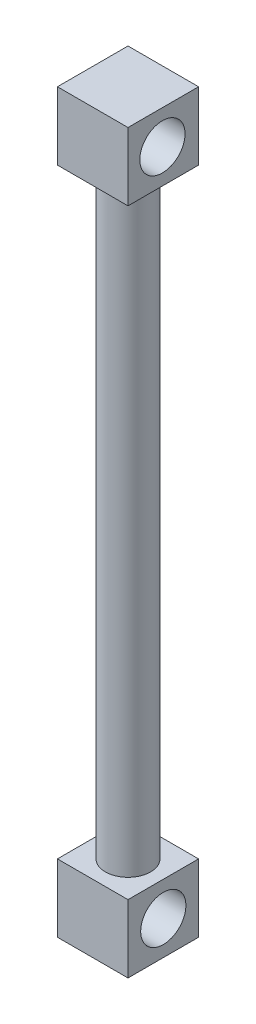
ISO-10303-21;
HEADER;
FILE_DESCRIPTION(('STEP AP214'),'2;1');
FILE_NAME('part.step','',(''),(''),'','','');
FILE_SCHEMA(('AUTOMOTIVE_DESIGN { 1 0 10303 214 1 1 1 1 }'));
ENDSEC;
DATA;
#1=APPLICATION_CONTEXT('core data for automotive mechanical design processes');
#2=APPLICATION_PROTOCOL_DEFINITION('international standard','automotive_design',2000,#1);
#3=PRODUCT_CONTEXT('',#1,'mechanical');
#4=PRODUCT('Part','Part','',(#3));
#5=PRODUCT_RELATED_PRODUCT_CATEGORY('part','',(#4));
#6=PRODUCT_DEFINITION_FORMATION('','',#4);
#7=PRODUCT_DEFINITION_CONTEXT('part definition',#1,'design');
#8=PRODUCT_DEFINITION('design','',#6,#7);
#9=PRODUCT_DEFINITION_SHAPE('','',#8);
#10=(LENGTH_UNIT() NAMED_UNIT(*) SI_UNIT(.MILLI.,.METRE.));
#11=(NAMED_UNIT(*) PLANE_ANGLE_UNIT() SI_UNIT($,.RADIAN.));
#12=(NAMED_UNIT(*) SI_UNIT($,.STERADIAN.) SOLID_ANGLE_UNIT());
#13=UNCERTAINTY_MEASURE_WITH_UNIT(LENGTH_MEASURE(1.E-05),#10,'distance_accuracy_value','');
#14=(GEOMETRIC_REPRESENTATION_CONTEXT(3) GLOBAL_UNCERTAINTY_ASSIGNED_CONTEXT((#13)) GLOBAL_UNIT_ASSIGNED_CONTEXT((#10,
#11,#12)) REPRESENTATION_CONTEXT('',''));
#15=CARTESIAN_POINT('',(0.,0.,0.));
#16=DIRECTION('',(0.,0.,1.));
#17=DIRECTION('',(1.,0.,0.));
#18=AXIS2_PLACEMENT_3D('',#15,#16,#17);
#19=CARTESIAN_POINT('',(0.,-13.28,1.56));
#20=DIRECTION('',(0.,1.,0.));
#21=DIRECTION('',(0.,0.,1.));
#22=AXIS2_PLACEMENT_3D('',#19,#20,#21);
#23=PLANE('',#22);
#24=CARTESIAN_POINT('',(0.78,-13.28,0.78));
#25=DIRECTION('',(0.,1.,0.));
#26=DIRECTION('',(0.,0.,1.));
#27=AXIS2_PLACEMENT_3D('',#24,#25,#26);
#28=CIRCLE('',#27,0.5);
#29=CARTESIAN_POINT('',(0.78,-13.28,1.28));
#30=VERTEX_POINT('',#29);
#31=EDGE_CURVE('E159',#30,#30,#28,.F.);
#32=ORIENTED_EDGE('',*,*,#31,.T.);
#33=EDGE_LOOP('',(#32));
#34=FACE_BOUND('',#33,.T.);
#35=DIRECTION('',(1.,0.,0.));
#36=VECTOR('',#35,1.);
#37=CARTESIAN_POINT('',(0.,-13.28,0.));
#38=LINE('',#37,#36);
#39=CARTESIAN_POINT('',(0.,-13.28,0.));
#40=VERTEX_POINT('',#39);
#41=CARTESIAN_POINT('',(1.56,-13.28,0.));
#42=VERTEX_POINT('',#41);
#43=EDGE_CURVE('E169',#40,#42,#38,.T.);
#44=ORIENTED_EDGE('',*,*,#43,.F.);
#45=DIRECTION('',(0.,0.,-1.));
#46=VECTOR('',#45,1.);
#47=CARTESIAN_POINT('',(0.,-13.28,1.56));
#48=LINE('',#47,#46);
#49=CARTESIAN_POINT('',(0.,-13.28,1.56));
#50=VERTEX_POINT('',#49);
#51=EDGE_CURVE('E11',#50,#40,#48,.T.);
#52=ORIENTED_EDGE('',*,*,#51,.F.);
#53=DIRECTION('',(1.,0.,0.));
#54=VECTOR('',#53,1.);
#55=CARTESIAN_POINT('',(0.,-13.28,1.56));
#56=LINE('',#55,#54);
#57=CARTESIAN_POINT('',(1.56,-13.28,1.56));
#58=VERTEX_POINT('',#57);
#59=EDGE_CURVE('E160',#50,#58,#56,.T.);
#60=ORIENTED_EDGE('',*,*,#59,.T.);
#61=DIRECTION('',(0.,0.,-1.));
#62=VECTOR('',#61,1.);
#63=CARTESIAN_POINT('',(1.56,-13.28,1.56));
#64=LINE('',#63,#62);
#65=EDGE_CURVE('E80',#58,#42,#64,.T.);
#66=ORIENTED_EDGE('',*,*,#65,.T.);
#67=EDGE_LOOP('',(#44,#52,#60,#66));
#68=FACE_BOUND('',#67,.T.);
#69=ADVANCED_FACE('F39',(#34,#68),#23,.T.);
#70=CARTESIAN_POINT('',(0.,0.,1.56));
#71=DIRECTION('',(-1.,0.,0.));
#72=DIRECTION('',(0.,0.,1.));
#73=AXIS2_PLACEMENT_3D('',#70,#71,#72);
#74=PLANE('',#73);
#75=CARTESIAN_POINT('',(0.,-14.03,0.78));
#76=DIRECTION('',(-1.,0.,0.));
#77=DIRECTION('',(0.,0.,1.));
#78=AXIS2_PLACEMENT_3D('',#75,#76,#77);
#79=CIRCLE('',#78,0.5);
#80=CARTESIAN_POINT('',(0.,-14.03,1.28));
#81=VERTEX_POINT('',#80);
#82=EDGE_CURVE('E189',#81,#81,#79,.T.);
#83=ORIENTED_EDGE('',*,*,#82,.F.);
#84=EDGE_LOOP('',(#83));
#85=FACE_BOUND('',#84,.T.);
#86=DIRECTION('',(0.,1.,0.));
#87=VECTOR('',#86,1.);
#88=CARTESIAN_POINT('',(0.,0.,0.));
#89=LINE('',#88,#87);
#90=CARTESIAN_POINT('',(0.,-14.78,0.));
#91=VERTEX_POINT('',#90);
#92=EDGE_CURVE('E172',#91,#40,#89,.T.);
#93=ORIENTED_EDGE('',*,*,#92,.F.);
#94=DIRECTION('',(0.,0.,-1.));
#95=VECTOR('',#94,1.);
#96=CARTESIAN_POINT('',(0.,-14.78,1.56));
#97=LINE('',#96,#95);
#98=CARTESIAN_POINT('',(0.,-14.78,1.56));
#99=VERTEX_POINT('',#98);
#100=EDGE_CURVE('E48',#99,#91,#97,.T.);
#101=ORIENTED_EDGE('',*,*,#100,.F.);
#102=DIRECTION('',(0.,1.,0.));
#103=VECTOR('',#102,1.);
#104=CARTESIAN_POINT('',(0.,0.,1.56));
#105=LINE('',#104,#103);
#106=EDGE_CURVE('E162',#99,#50,#105,.T.);
#107=ORIENTED_EDGE('',*,*,#106,.T.);
#108=ORIENTED_EDGE('',*,*,#51,.T.);
#109=EDGE_LOOP('',(#93,#101,#107,#108));
#110=FACE_BOUND('',#109,.T.);
#111=ADVANCED_FACE('F198',(#85,#110),#74,.T.);
#112=CARTESIAN_POINT('',(0.,-14.78,1.56));
#113=DIRECTION('',(0.,1.,0.));
#114=DIRECTION('',(0.,0.,1.));
#115=AXIS2_PLACEMENT_3D('',#112,#113,#114);
#116=PLANE('',#115);
#117=DIRECTION('',(1.,0.,0.));
#118=VECTOR('',#117,1.);
#119=CARTESIAN_POINT('',(0.,-14.78,0.));
#120=LINE('',#119,#118);
#121=CARTESIAN_POINT('',(1.56,-14.78,0.));
#122=VERTEX_POINT('',#121);
#123=EDGE_CURVE('E73',#91,#122,#120,.T.);
#124=ORIENTED_EDGE('',*,*,#123,.T.);
#125=DIRECTION('',(0.,0.,-1.));
#126=VECTOR('',#125,1.);
#127=CARTESIAN_POINT('',(1.56,-14.78,1.56));
#128=LINE('',#127,#126);
#129=CARTESIAN_POINT('',(1.56,-14.78,1.56));
#130=VERTEX_POINT('',#129);
#131=EDGE_CURVE('E178',#130,#122,#128,.T.);
#132=ORIENTED_EDGE('',*,*,#131,.F.);
#133=DIRECTION('',(1.,0.,0.));
#134=VECTOR('',#133,1.);
#135=CARTESIAN_POINT('',(0.,-14.78,1.56));
#136=LINE('',#135,#134);
#137=EDGE_CURVE('E166',#99,#130,#136,.T.);
#138=ORIENTED_EDGE('',*,*,#137,.F.);
#139=ORIENTED_EDGE('',*,*,#100,.T.);
#140=EDGE_LOOP('',(#124,#132,#138,#139));
#141=FACE_BOUND('',#140,.T.);
#142=ADVANCED_FACE('F201',(#141),#116,.F.);
#143=CARTESIAN_POINT('',(1.56,0.,1.56));
#144=DIRECTION('',(-1.,0.,0.));
#145=DIRECTION('',(0.,0.,1.));
#146=AXIS2_PLACEMENT_3D('',#143,#144,#145);
#147=PLANE('',#146);
#148=CARTESIAN_POINT('',(1.56,-14.03,0.78));
#149=DIRECTION('',(-1.,0.,0.));
#150=DIRECTION('',(0.,0.,1.));
#151=AXIS2_PLACEMENT_3D('',#148,#149,#150);
#152=CIRCLE('',#151,0.5);
#153=CARTESIAN_POINT('',(1.56,-14.03,1.28));
#154=VERTEX_POINT('',#153);
#155=EDGE_CURVE('E42',#154,#154,#152,.T.);
#156=ORIENTED_EDGE('',*,*,#155,.T.);
#157=EDGE_LOOP('',(#156));
#158=FACE_BOUND('',#157,.T.);
#159=DIRECTION('',(0.,1.,0.));
#160=VECTOR('',#159,1.);
#161=CARTESIAN_POINT('',(1.56,0.,0.));
#162=LINE('',#161,#160);
#163=EDGE_CURVE('E163',#122,#42,#162,.T.);
#164=ORIENTED_EDGE('',*,*,#163,.T.);
#165=ORIENTED_EDGE('',*,*,#65,.F.);
#166=DIRECTION('',(0.,1.,0.));
#167=VECTOR('',#166,1.);
#168=CARTESIAN_POINT('',(1.56,0.,1.56));
#169=LINE('',#168,#167);
#170=EDGE_CURVE('E57',#130,#58,#169,.T.);
#171=ORIENTED_EDGE('',*,*,#170,.F.);
#172=ORIENTED_EDGE('',*,*,#131,.T.);
#173=EDGE_LOOP('',(#164,#165,#171,#172));
#174=FACE_BOUND('',#173,.T.);
#175=ADVANCED_FACE('F208',(#158,#174),#147,.F.);
#176=CARTESIAN_POINT('',(0.,0.,1.56));
#177=DIRECTION('',(0.,0.,1.));
#178=DIRECTION('',(1.,0.,0.));
#179=AXIS2_PLACEMENT_3D('',#176,#177,#178);
#180=PLANE('',#179);
#181=ORIENTED_EDGE('',*,*,#59,.F.);
#182=ORIENTED_EDGE('',*,*,#106,.F.);
#183=ORIENTED_EDGE('',*,*,#137,.T.);
#184=ORIENTED_EDGE('',*,*,#170,.T.);
#185=EDGE_LOOP('',(#181,#182,#183,#184));
#186=FACE_BOUND('',#185,.T.);
#187=ADVANCED_FACE('F210',(#186),#180,.T.);
#188=CARTESIAN_POINT('',(0.,0.,0.));
#189=DIRECTION('',(0.,0.,1.));
#190=DIRECTION('',(1.,0.,0.));
#191=AXIS2_PLACEMENT_3D('',#188,#189,#190);
#192=PLANE('',#191);
#193=ORIENTED_EDGE('',*,*,#43,.T.);
#194=ORIENTED_EDGE('',*,*,#163,.F.);
#195=ORIENTED_EDGE('',*,*,#123,.F.);
#196=ORIENTED_EDGE('',*,*,#92,.T.);
#197=EDGE_LOOP('',(#193,#194,#195,#196));
#198=FACE_BOUND('',#197,.T.);
#199=ADVANCED_FACE('F205',(#198),#192,.F.);
#200=CARTESIAN_POINT('',(0.78,-14.,0.78));
#201=DIRECTION('',(0.,1.,0.));
#202=DIRECTION('',(0.,0.,1.));
#203=AXIS2_PLACEMENT_3D('',#200,#201,#202);
#204=CYLINDRICAL_SURFACE('',#203,0.5);
#205=ORIENTED_EDGE('',*,*,#31,.F.);
#206=EDGE_LOOP('',(#205));
#207=FACE_BOUND('',#206,.T.);
#208=CARTESIAN_POINT('',(0.78,0.,0.78));
#209=DIRECTION('',(0.,-1.,0.));
#210=DIRECTION('',(0.,0.,-1.));
#211=AXIS2_PLACEMENT_3D('',#208,#209,#210);
#212=CIRCLE('',#211,0.5);
#213=CARTESIAN_POINT('',(0.78,0.,0.28));
#214=VERTEX_POINT('',#213);
#215=EDGE_CURVE('E121',#214,#214,#212,.T.);
#216=ORIENTED_EDGE('',*,*,#215,.T.);
#217=EDGE_LOOP('',(#216));
#218=FACE_BOUND('',#217,.T.);
#219=ADVANCED_FACE('F217',(#207,#218),#204,.T.);
#220=CARTESIAN_POINT('',(0.,0.,1.56));
#221=DIRECTION('',(-1.,0.,0.));
#222=DIRECTION('',(0.,0.,1.));
#223=AXIS2_PLACEMENT_3D('',#220,#221,#222);
#224=PLANE('',#223);
#225=CARTESIAN_POINT('',(0.,0.75,0.799406883643374));
#226=DIRECTION('',(-1.,0.,0.));
#227=DIRECTION('',(0.,0.,1.));
#228=AXIS2_PLACEMENT_3D('',#225,#226,#227);
#229=CIRCLE('',#228,0.5);
#230=CARTESIAN_POINT('',(0.,0.75,1.29940688364337));
#231=VERTEX_POINT('',#230);
#232=EDGE_CURVE('E141',#231,#231,#229,.T.);
#233=ORIENTED_EDGE('',*,*,#232,.F.);
#234=EDGE_LOOP('',(#233));
#235=FACE_BOUND('',#234,.T.);
#236=DIRECTION('',(0.,1.,0.));
#237=VECTOR('',#236,1.);
#238=CARTESIAN_POINT('',(0.,0.,0.));
#239=LINE('',#238,#237);
#240=CARTESIAN_POINT('',(0.,0.,0.));
#241=VERTEX_POINT('',#240);
#242=CARTESIAN_POINT('',(0.,1.5,0.));
#243=VERTEX_POINT('',#242);
#244=EDGE_CURVE('E118',#241,#243,#239,.T.);
#245=ORIENTED_EDGE('',*,*,#244,.F.);
#246=DIRECTION('',(0.,0.,-1.));
#247=VECTOR('',#246,1.);
#248=CARTESIAN_POINT('',(0.,0.,1.56));
#249=LINE('',#248,#247);
#250=CARTESIAN_POINT('',(0.,0.,1.56));
#251=VERTEX_POINT('',#250);
#252=EDGE_CURVE('E111',#251,#241,#249,.T.);
#253=ORIENTED_EDGE('',*,*,#252,.F.);
#254=DIRECTION('',(0.,1.,0.));
#255=VECTOR('',#254,1.);
#256=CARTESIAN_POINT('',(0.,0.,1.56));
#257=LINE('',#256,#255);
#258=CARTESIAN_POINT('',(0.,1.5,1.56));
#259=VERTEX_POINT('',#258);
#260=EDGE_CURVE('E115',#251,#259,#257,.T.);
#261=ORIENTED_EDGE('',*,*,#260,.T.);
#262=DIRECTION('',(0.,0.,-1.));
#263=VECTOR('',#262,1.);
#264=CARTESIAN_POINT('',(0.,1.5,1.56));
#265=LINE('',#264,#263);
#266=EDGE_CURVE('E146',#259,#243,#265,.T.);
#267=ORIENTED_EDGE('',*,*,#266,.T.);
#268=EDGE_LOOP('',(#245,#253,#261,#267));
#269=FACE_BOUND('',#268,.T.);
#270=ADVANCED_FACE('F113',(#235,#269),#224,.T.);
#271=CARTESIAN_POINT('',(0.,0.,1.56));
#272=DIRECTION('',(0.,1.,0.));
#273=DIRECTION('',(0.,0.,1.));
#274=AXIS2_PLACEMENT_3D('',#271,#272,#273);
#275=PLANE('',#274);
#276=ORIENTED_EDGE('',*,*,#215,.F.);
#277=EDGE_LOOP('',(#276));
#278=FACE_BOUND('',#277,.T.);
#279=DIRECTION('',(1.,0.,0.));
#280=VECTOR('',#279,1.);
#281=CARTESIAN_POINT('',(0.,0.,0.));
#282=LINE('',#281,#280);
#283=CARTESIAN_POINT('',(1.56,0.,0.));
#284=VERTEX_POINT('',#283);
#285=EDGE_CURVE('E148',#241,#284,#282,.T.);
#286=ORIENTED_EDGE('',*,*,#285,.T.);
#287=DIRECTION('',(0.,0.,-1.));
#288=VECTOR('',#287,1.);
#289=CARTESIAN_POINT('',(1.56,0.,1.56));
#290=LINE('',#289,#288);
#291=CARTESIAN_POINT('',(1.56,0.,1.56));
#292=VERTEX_POINT('',#291);
#293=EDGE_CURVE('E122',#292,#284,#290,.T.);
#294=ORIENTED_EDGE('',*,*,#293,.F.);
#295=DIRECTION('',(1.,0.,0.));
#296=VECTOR('',#295,1.);
#297=CARTESIAN_POINT('',(0.,0.,1.56));
#298=LINE('',#297,#296);
#299=EDGE_CURVE('E125',#251,#292,#298,.T.);
#300=ORIENTED_EDGE('',*,*,#299,.F.);
#301=ORIENTED_EDGE('',*,*,#252,.T.);
#302=EDGE_LOOP('',(#286,#294,#300,#301));
#303=FACE_BOUND('',#302,.T.);
#304=ADVANCED_FACE('F126',(#278,#303),#275,.F.);
#305=CARTESIAN_POINT('',(1.56,0.,1.56));
#306=DIRECTION('',(-1.,0.,0.));
#307=DIRECTION('',(0.,0.,1.));
#308=AXIS2_PLACEMENT_3D('',#305,#306,#307);
#309=PLANE('',#308);
#310=CARTESIAN_POINT('',(1.56,0.75,0.799406883643374));
#311=DIRECTION('',(-1.,0.,0.));
#312=DIRECTION('',(0.,0.,1.));
#313=AXIS2_PLACEMENT_3D('',#310,#311,#312);
#314=CIRCLE('',#313,0.5);
#315=CARTESIAN_POINT('',(1.56,0.75,1.29940688364337));
#316=VERTEX_POINT('',#315);
#317=EDGE_CURVE('E149',#316,#316,#314,.T.);
#318=ORIENTED_EDGE('',*,*,#317,.T.);
#319=EDGE_LOOP('',(#318));
#320=FACE_BOUND('',#319,.T.);
#321=DIRECTION('',(0.,1.,0.));
#322=VECTOR('',#321,1.);
#323=CARTESIAN_POINT('',(1.56,0.,0.));
#324=LINE('',#323,#322);
#325=CARTESIAN_POINT('',(1.56,1.5,0.));
#326=VERTEX_POINT('',#325);
#327=EDGE_CURVE('E138',#284,#326,#324,.T.);
#328=ORIENTED_EDGE('',*,*,#327,.T.);
#329=DIRECTION('',(0.,0.,-1.));
#330=VECTOR('',#329,1.);
#331=CARTESIAN_POINT('',(1.56,1.5,1.56));
#332=LINE('',#331,#330);
#333=CARTESIAN_POINT('',(1.56,1.5,1.56));
#334=VERTEX_POINT('',#333);
#335=EDGE_CURVE('E154',#334,#326,#332,.T.);
#336=ORIENTED_EDGE('',*,*,#335,.F.);
#337=DIRECTION('',(0.,1.,0.));
#338=VECTOR('',#337,1.);
#339=CARTESIAN_POINT('',(1.56,0.,1.56));
#340=LINE('',#339,#338);
#341=EDGE_CURVE('E130',#292,#334,#340,.T.);
#342=ORIENTED_EDGE('',*,*,#341,.F.);
#343=ORIENTED_EDGE('',*,*,#293,.T.);
#344=EDGE_LOOP('',(#328,#336,#342,#343));
#345=FACE_BOUND('',#344,.T.);
#346=ADVANCED_FACE('F224',(#320,#345),#309,.F.);
#347=CARTESIAN_POINT('',(0.,1.5,1.56));
#348=DIRECTION('',(0.,1.,0.));
#349=DIRECTION('',(0.,0.,1.));
#350=AXIS2_PLACEMENT_3D('',#347,#348,#349);
#351=PLANE('',#350);
#352=DIRECTION('',(1.,0.,0.));
#353=VECTOR('',#352,1.);
#354=CARTESIAN_POINT('',(0.,1.5,0.));
#355=LINE('',#354,#353);
#356=EDGE_CURVE('E135',#243,#326,#355,.T.);
#357=ORIENTED_EDGE('',*,*,#356,.F.);
#358=ORIENTED_EDGE('',*,*,#266,.F.);
#359=DIRECTION('',(1.,0.,0.));
#360=VECTOR('',#359,1.);
#361=CARTESIAN_POINT('',(0.,1.5,1.56));
#362=LINE('',#361,#360);
#363=EDGE_CURVE('E134',#259,#334,#362,.T.);
#364=ORIENTED_EDGE('',*,*,#363,.T.);
#365=ORIENTED_EDGE('',*,*,#335,.T.);
#366=EDGE_LOOP('',(#357,#358,#364,#365));
#367=FACE_BOUND('',#366,.T.);
#368=ADVANCED_FACE('F230',(#367),#351,.T.);
#369=CARTESIAN_POINT('',(0.,0.,1.56));
#370=DIRECTION('',(0.,0.,1.));
#371=DIRECTION('',(1.,0.,0.));
#372=AXIS2_PLACEMENT_3D('',#369,#370,#371);
#373=PLANE('',#372);
#374=ORIENTED_EDGE('',*,*,#260,.F.);
#375=ORIENTED_EDGE('',*,*,#299,.T.);
#376=ORIENTED_EDGE('',*,*,#341,.T.);
#377=ORIENTED_EDGE('',*,*,#363,.F.);
#378=EDGE_LOOP('',(#374,#375,#376,#377));
#379=FACE_BOUND('',#378,.T.);
#380=ADVANCED_FACE('F132',(#379),#373,.T.);
#381=CARTESIAN_POINT('',(0.,0.,0.));
#382=DIRECTION('',(0.,0.,1.));
#383=DIRECTION('',(1.,0.,0.));
#384=AXIS2_PLACEMENT_3D('',#381,#382,#383);
#385=PLANE('',#384);
#386=ORIENTED_EDGE('',*,*,#244,.T.);
#387=ORIENTED_EDGE('',*,*,#356,.T.);
#388=ORIENTED_EDGE('',*,*,#327,.F.);
#389=ORIENTED_EDGE('',*,*,#285,.F.);
#390=EDGE_LOOP('',(#386,#387,#388,#389));
#391=FACE_BOUND('',#390,.T.);
#392=ADVANCED_FACE('F276',(#391),#385,.F.);
#393=CARTESIAN_POINT('',(14.,0.75,0.799406883643374));
#394=DIRECTION('',(-1.,0.,0.));
#395=DIRECTION('',(0.,0.,1.));
#396=AXIS2_PLACEMENT_3D('',#393,#394,#395);
#397=CYLINDRICAL_SURFACE('',#396,0.5);
#398=ORIENTED_EDGE('',*,*,#232,.T.);
#399=EDGE_LOOP('',(#398));
#400=FACE_BOUND('',#399,.T.);
#401=ORIENTED_EDGE('',*,*,#317,.F.);
#402=EDGE_LOOP('',(#401));
#403=FACE_BOUND('',#402,.T.);
#404=ADVANCED_FACE('F289',(#400,#403),#397,.F.);
#405=CARTESIAN_POINT('',(14.,-14.03,0.78));
#406=DIRECTION('',(-1.,0.,0.));
#407=DIRECTION('',(0.,0.,1.));
#408=AXIS2_PLACEMENT_3D('',#405,#406,#407);
#409=CYLINDRICAL_SURFACE('',#408,0.5);
#410=ORIENTED_EDGE('',*,*,#82,.T.);
#411=EDGE_LOOP('',(#410));
#412=FACE_BOUND('',#411,.T.);
#413=ORIENTED_EDGE('',*,*,#155,.F.);
#414=EDGE_LOOP('',(#413));
#415=FACE_BOUND('',#414,.T.);
#416=ADVANCED_FACE('F195',(#412,#415),#409,.F.);
#417=CLOSED_SHELL('',(#69,#111,#142,#175,#187,#199,#219,#270,#304,#346,#368,#380,#392,#404,#416));
#418=MANIFOLD_SOLID_BREP('B2',#417);
#419=ADVANCED_BREP_SHAPE_REPRESENTATION('',(#18,#418),#14);
#420=SHAPE_DEFINITION_REPRESENTATION(#9,#419);
ENDSEC;
END-ISO-10303-21;
